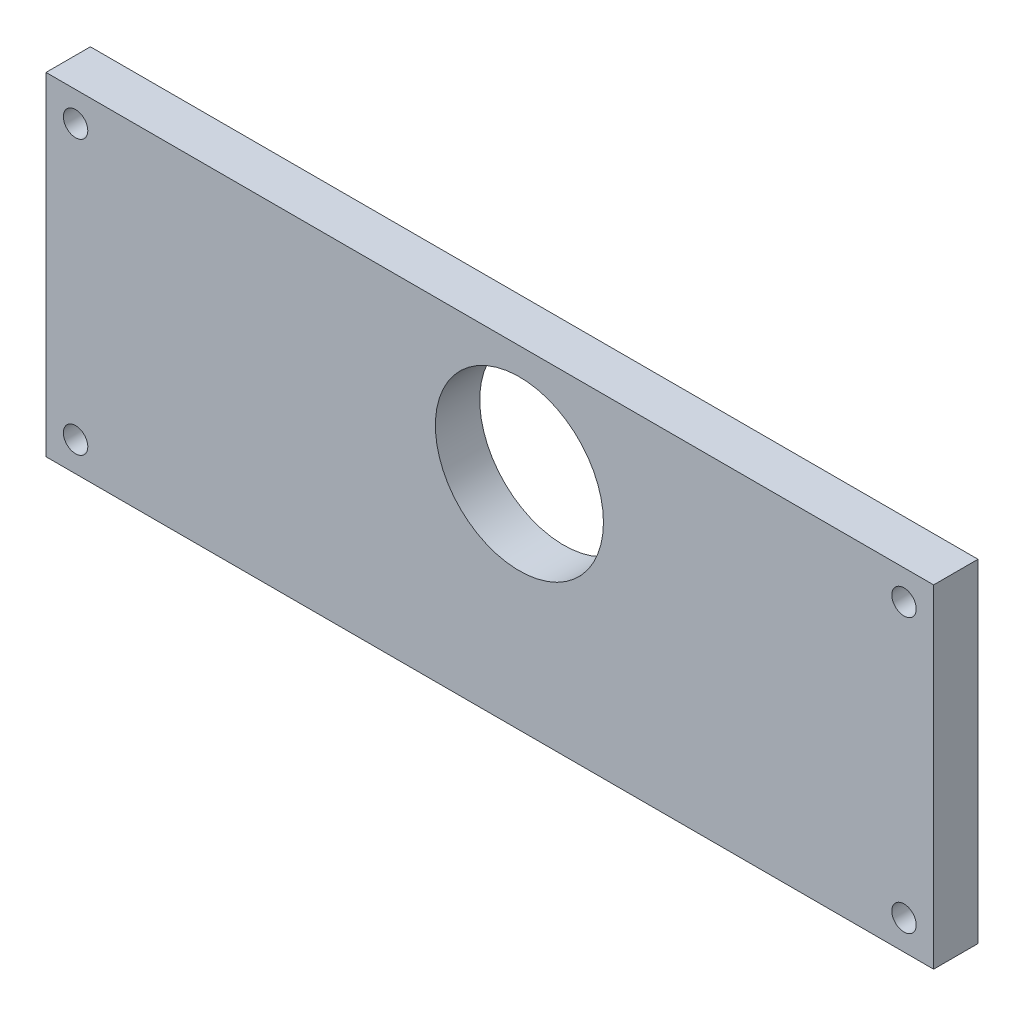
ISO-10303-21;
HEADER;
FILE_DESCRIPTION(('STEP AP214'),'2;1');
FILE_NAME('part.step','',(''),(''),'','','');
FILE_SCHEMA(('AUTOMOTIVE_DESIGN { 1 0 10303 214 1 1 1 1 }'));
ENDSEC;
DATA;
#1=APPLICATION_CONTEXT('core data for automotive mechanical design processes');
#2=APPLICATION_PROTOCOL_DEFINITION('international standard','automotive_design',2000,#1);
#3=PRODUCT_CONTEXT('',#1,'mechanical');
#4=PRODUCT('Part','Part','',(#3));
#5=PRODUCT_RELATED_PRODUCT_CATEGORY('part','',(#4));
#6=PRODUCT_DEFINITION_FORMATION('','',#4);
#7=PRODUCT_DEFINITION_CONTEXT('part definition',#1,'design');
#8=PRODUCT_DEFINITION('design','',#6,#7);
#9=PRODUCT_DEFINITION_SHAPE('','',#8);
#10=(LENGTH_UNIT() NAMED_UNIT(*) SI_UNIT(.MILLI.,.METRE.));
#11=(NAMED_UNIT(*) PLANE_ANGLE_UNIT() SI_UNIT($,.RADIAN.));
#12=(NAMED_UNIT(*) SI_UNIT($,.STERADIAN.) SOLID_ANGLE_UNIT());
#13=UNCERTAINTY_MEASURE_WITH_UNIT(LENGTH_MEASURE(1.E-05),#10,'distance_accuracy_value','');
#14=(GEOMETRIC_REPRESENTATION_CONTEXT(3) GLOBAL_UNCERTAINTY_ASSIGNED_CONTEXT((#13)) GLOBAL_UNIT_ASSIGNED_CONTEXT((#10,
#11,#12)) REPRESENTATION_CONTEXT('',''));
#15=CARTESIAN_POINT('',(0.,0.,0.));
#16=DIRECTION('',(0.,0.,1.));
#17=DIRECTION('',(1.,0.,0.));
#18=AXIS2_PLACEMENT_3D('',#15,#16,#17);
#19=CARTESIAN_POINT('',(4.,41.,6.));
#20=DIRECTION('',(0.,0.,-1.));
#21=DIRECTION('',(-1.,0.,0.));
#22=AXIS2_PLACEMENT_3D('',#19,#20,#21);
#23=CYLINDRICAL_SURFACE('',#22,1.65);
#24=CARTESIAN_POINT('',(4.,41.,6.));
#25=DIRECTION('',(0.,0.,1.));
#26=DIRECTION('',(1.,0.,0.));
#27=AXIS2_PLACEMENT_3D('',#24,#25,#26);
#28=CIRCLE('',#27,1.65);
#29=CARTESIAN_POINT('',(5.65,41.,6.));
#30=VERTEX_POINT('',#29);
#31=EDGE_CURVE('E139',#30,#30,#28,.T.);
#32=ORIENTED_EDGE('',*,*,#31,.T.);
#33=EDGE_LOOP('',(#32));
#34=FACE_BOUND('',#33,.T.);
#35=CARTESIAN_POINT('',(4.,41.,3.));
#36=DIRECTION('',(0.,0.,-1.));
#37=DIRECTION('',(-1.,0.,0.));
#38=AXIS2_PLACEMENT_3D('',#35,#36,#37);
#39=CIRCLE('',#38,1.65);
#40=CARTESIAN_POINT('',(2.35,41.,3.));
#41=VERTEX_POINT('',#40);
#42=EDGE_CURVE('E163',#41,#41,#39,.T.);
#43=ORIENTED_EDGE('',*,*,#42,.T.);
#44=EDGE_LOOP('',(#43));
#45=FACE_BOUND('',#44,.T.);
#46=ADVANCED_FACE('F43',(#34,#45),#23,.F.);
#47=CARTESIAN_POINT('',(4.,4.,6.));
#48=DIRECTION('',(0.,0.,-1.));
#49=DIRECTION('',(-1.,0.,0.));
#50=AXIS2_PLACEMENT_3D('',#47,#48,#49);
#51=CYLINDRICAL_SURFACE('',#50,1.65);
#52=CARTESIAN_POINT('',(4.,4.,6.));
#53=DIRECTION('',(0.,0.,1.));
#54=DIRECTION('',(-1.,0.,0.));
#55=AXIS2_PLACEMENT_3D('',#52,#53,#54);
#56=CIRCLE('',#55,1.65);
#57=CARTESIAN_POINT('',(2.35,4.,6.));
#58=VERTEX_POINT('',#57);
#59=EDGE_CURVE('E146',#58,#58,#56,.T.);
#60=ORIENTED_EDGE('',*,*,#59,.T.);
#61=EDGE_LOOP('',(#60));
#62=FACE_BOUND('',#61,.T.);
#63=CARTESIAN_POINT('',(4.,4.,3.));
#64=DIRECTION('',(0.,0.,-1.));
#65=DIRECTION('',(-1.,0.,0.));
#66=AXIS2_PLACEMENT_3D('',#63,#64,#65);
#67=CIRCLE('',#66,1.65);
#68=CARTESIAN_POINT('',(2.35,4.,3.));
#69=VERTEX_POINT('',#68);
#70=EDGE_CURVE('E170',#69,#69,#67,.T.);
#71=ORIENTED_EDGE('',*,*,#70,.T.);
#72=EDGE_LOOP('',(#71));
#73=FACE_BOUND('',#72,.T.);
#74=ADVANCED_FACE('F232',(#62,#73),#51,.F.);
#75=CARTESIAN_POINT('',(116.,41.,6.));
#76=DIRECTION('',(0.,0.,-1.));
#77=DIRECTION('',(-1.,0.,0.));
#78=AXIS2_PLACEMENT_3D('',#75,#76,#77);
#79=CYLINDRICAL_SURFACE('',#78,1.65);
#80=CARTESIAN_POINT('',(116.,41.,6.));
#81=DIRECTION('',(0.,0.,1.));
#82=DIRECTION('',(-1.,0.,0.));
#83=AXIS2_PLACEMENT_3D('',#80,#81,#82);
#84=CIRCLE('',#83,1.65);
#85=CARTESIAN_POINT('',(114.35,41.,6.));
#86=VERTEX_POINT('',#85);
#87=EDGE_CURVE('E150',#86,#86,#84,.T.);
#88=ORIENTED_EDGE('',*,*,#87,.T.);
#89=EDGE_LOOP('',(#88));
#90=FACE_BOUND('',#89,.T.);
#91=CARTESIAN_POINT('',(116.,41.,3.));
#92=DIRECTION('',(0.,0.,-1.));
#93=DIRECTION('',(-1.,0.,0.));
#94=AXIS2_PLACEMENT_3D('',#91,#92,#93);
#95=CIRCLE('',#94,1.65);
#96=CARTESIAN_POINT('',(114.35,41.,3.));
#97=VERTEX_POINT('',#96);
#98=EDGE_CURVE('E171',#97,#97,#95,.T.);
#99=ORIENTED_EDGE('',*,*,#98,.T.);
#100=EDGE_LOOP('',(#99));
#101=FACE_BOUND('',#100,.T.);
#102=ADVANCED_FACE('F238',(#90,#101),#79,.F.);
#103=CARTESIAN_POINT('',(116.,4.,6.));
#104=DIRECTION('',(0.,0.,-1.));
#105=DIRECTION('',(-1.,0.,0.));
#106=AXIS2_PLACEMENT_3D('',#103,#104,#105);
#107=CYLINDRICAL_SURFACE('',#106,1.65);
#108=CARTESIAN_POINT('',(116.,4.,6.));
#109=DIRECTION('',(0.,0.,1.));
#110=DIRECTION('',(1.,0.,0.));
#111=AXIS2_PLACEMENT_3D('',#108,#109,#110);
#112=CIRCLE('',#111,1.65);
#113=CARTESIAN_POINT('',(117.65,4.,6.));
#114=VERTEX_POINT('',#113);
#115=EDGE_CURVE('E154',#114,#114,#112,.T.);
#116=ORIENTED_EDGE('',*,*,#115,.T.);
#117=EDGE_LOOP('',(#116));
#118=FACE_BOUND('',#117,.T.);
#119=CARTESIAN_POINT('',(116.,4.,3.));
#120=DIRECTION('',(0.,0.,-1.));
#121=DIRECTION('',(-1.,0.,0.));
#122=AXIS2_PLACEMENT_3D('',#119,#120,#121);
#123=CIRCLE('',#122,1.65);
#124=CARTESIAN_POINT('',(114.35,4.,3.));
#125=VERTEX_POINT('',#124);
#126=EDGE_CURVE('E184',#125,#125,#123,.T.);
#127=ORIENTED_EDGE('',*,*,#126,.T.);
#128=EDGE_LOOP('',(#127));
#129=FACE_BOUND('',#128,.T.);
#130=ADVANCED_FACE('F250',(#118,#129),#107,.F.);
#131=CARTESIAN_POINT('',(0.,0.,6.));
#132=DIRECTION('',(0.,0.,-1.));
#133=DIRECTION('',(-1.,0.,0.));
#134=AXIS2_PLACEMENT_3D('',#131,#132,#133);
#135=PLANE('',#134);
#136=DIRECTION('',(0.,-1.,0.));
#137=VECTOR('',#136,1.);
#138=CARTESIAN_POINT('',(0.,0.,6.));
#139=LINE('',#138,#137);
#140=CARTESIAN_POINT('',(0.,45.,6.));
#141=VERTEX_POINT('',#140);
#142=CARTESIAN_POINT('',(0.,0.,6.));
#143=VERTEX_POINT('',#142);
#144=EDGE_CURVE('E97',#141,#143,#139,.T.);
#145=ORIENTED_EDGE('',*,*,#144,.T.);
#146=DIRECTION('',(1.,0.,0.));
#147=VECTOR('',#146,1.);
#148=CARTESIAN_POINT('',(0.,0.,6.));
#149=LINE('',#148,#147);
#150=CARTESIAN_POINT('',(120.,0.,6.));
#151=VERTEX_POINT('',#150);
#152=EDGE_CURVE('E91',#143,#151,#149,.T.);
#153=ORIENTED_EDGE('',*,*,#152,.T.);
#154=DIRECTION('',(0.,1.,0.));
#155=VECTOR('',#154,1.);
#156=CARTESIAN_POINT('',(120.,0.,6.));
#157=LINE('',#156,#155);
#158=CARTESIAN_POINT('',(120.,45.,6.));
#159=VERTEX_POINT('',#158);
#160=EDGE_CURVE('E95',#151,#159,#157,.T.);
#161=ORIENTED_EDGE('',*,*,#160,.T.);
#162=DIRECTION('',(-1.,0.,0.));
#163=VECTOR('',#162,1.);
#164=CARTESIAN_POINT('',(0.,45.,6.));
#165=LINE('',#164,#163);
#166=EDGE_CURVE('E61',#159,#141,#165,.T.);
#167=ORIENTED_EDGE('',*,*,#166,.T.);
#168=EDGE_LOOP('',(#145,#153,#161,#167));
#169=FACE_BOUND('',#168,.T.);
#170=CARTESIAN_POINT('',(64.,30.,6.));
#171=DIRECTION('',(0.,0.,1.));
#172=DIRECTION('',(1.,0.,0.));
#173=AXIS2_PLACEMENT_3D('',#170,#171,#172);
#174=CIRCLE('',#173,11.3625);
#175=CARTESIAN_POINT('',(75.3625,30.,6.));
#176=VERTEX_POINT('',#175);
#177=EDGE_CURVE('E117',#176,#176,#174,.T.);
#178=ORIENTED_EDGE('',*,*,#177,.F.);
#179=EDGE_LOOP('',(#178));
#180=FACE_BOUND('',#179,.T.);
#181=ORIENTED_EDGE('',*,*,#31,.F.);
#182=EDGE_LOOP('',(#181));
#183=FACE_BOUND('',#182,.T.);
#184=ORIENTED_EDGE('',*,*,#59,.F.);
#185=EDGE_LOOP('',(#184));
#186=FACE_BOUND('',#185,.T.);
#187=ORIENTED_EDGE('',*,*,#87,.F.);
#188=EDGE_LOOP('',(#187));
#189=FACE_BOUND('',#188,.T.);
#190=ORIENTED_EDGE('',*,*,#115,.F.);
#191=EDGE_LOOP('',(#190));
#192=FACE_BOUND('',#191,.T.);
#193=ADVANCED_FACE('F92',(#169,#180,#183,#186,#189,#192),#135,.F.);
#194=CARTESIAN_POINT('',(0.,0.,0.));
#195=DIRECTION('',(0.,0.,-1.));
#196=DIRECTION('',(-1.,0.,0.));
#197=AXIS2_PLACEMENT_3D('',#194,#195,#196);
#198=PLANE('',#197);
#199=CARTESIAN_POINT('',(116.,41.,0.));
#200=DIRECTION('',(0.,0.,-1.));
#201=DIRECTION('',(-1.,0.,0.));
#202=AXIS2_PLACEMENT_3D('',#199,#200,#201);
#203=CIRCLE('',#202,3.00000000000001);
#204=CARTESIAN_POINT('',(113.,41.,0.));
#205=VERTEX_POINT('',#204);
#206=EDGE_CURVE('E176',#205,#205,#203,.T.);
#207=ORIENTED_EDGE('',*,*,#206,.F.);
#208=EDGE_LOOP('',(#207));
#209=FACE_BOUND('',#208,.T.);
#210=CARTESIAN_POINT('',(116.,4.,0.));
#211=DIRECTION('',(0.,0.,-1.));
#212=DIRECTION('',(-1.,0.,0.));
#213=AXIS2_PLACEMENT_3D('',#210,#211,#212);
#214=CIRCLE('',#213,3.00000000000001);
#215=CARTESIAN_POINT('',(113.,4.,0.));
#216=VERTEX_POINT('',#215);
#217=EDGE_CURVE('E189',#216,#216,#214,.T.);
#218=ORIENTED_EDGE('',*,*,#217,.F.);
#219=EDGE_LOOP('',(#218));
#220=FACE_BOUND('',#219,.T.);
#221=CARTESIAN_POINT('',(4.,4.,0.));
#222=DIRECTION('',(0.,0.,-1.));
#223=DIRECTION('',(-1.,0.,0.));
#224=AXIS2_PLACEMENT_3D('',#221,#222,#223);
#225=CIRCLE('',#224,3.);
#226=CARTESIAN_POINT('',(0.999999999999999,4.,0.));
#227=VERTEX_POINT('',#226);
#228=EDGE_CURVE('E199',#227,#227,#225,.T.);
#229=ORIENTED_EDGE('',*,*,#228,.F.);
#230=EDGE_LOOP('',(#229));
#231=FACE_BOUND('',#230,.T.);
#232=CARTESIAN_POINT('',(4.,41.,0.));
#233=DIRECTION('',(0.,0.,-1.));
#234=DIRECTION('',(-1.,0.,0.));
#235=AXIS2_PLACEMENT_3D('',#232,#233,#234);
#236=CIRCLE('',#235,3.);
#237=CARTESIAN_POINT('',(0.999999999999997,41.,0.));
#238=VERTEX_POINT('',#237);
#239=EDGE_CURVE('E159',#238,#238,#236,.T.);
#240=ORIENTED_EDGE('',*,*,#239,.F.);
#241=EDGE_LOOP('',(#240));
#242=FACE_BOUND('',#241,.T.);
#243=DIRECTION('',(0.,-1.,0.));
#244=VECTOR('',#243,1.);
#245=CARTESIAN_POINT('',(0.,0.,0.));
#246=LINE('',#245,#244);
#247=CARTESIAN_POINT('',(0.,45.,0.));
#248=VERTEX_POINT('',#247);
#249=CARTESIAN_POINT('',(0.,0.,0.));
#250=VERTEX_POINT('',#249);
#251=EDGE_CURVE('E113',#248,#250,#246,.T.);
#252=ORIENTED_EDGE('',*,*,#251,.F.);
#253=DIRECTION('',(-1.,0.,0.));
#254=VECTOR('',#253,1.);
#255=CARTESIAN_POINT('',(0.,45.,0.));
#256=LINE('',#255,#254);
#257=CARTESIAN_POINT('',(120.,45.,0.));
#258=VERTEX_POINT('',#257);
#259=EDGE_CURVE('E84',#258,#248,#256,.T.);
#260=ORIENTED_EDGE('',*,*,#259,.F.);
#261=DIRECTION('',(0.,1.,0.));
#262=VECTOR('',#261,1.);
#263=CARTESIAN_POINT('',(120.,0.,0.));
#264=LINE('',#263,#262);
#265=CARTESIAN_POINT('',(120.,0.,0.));
#266=VERTEX_POINT('',#265);
#267=EDGE_CURVE('E78',#266,#258,#264,.T.);
#268=ORIENTED_EDGE('',*,*,#267,.F.);
#269=DIRECTION('',(1.,0.,0.));
#270=VECTOR('',#269,1.);
#271=CARTESIAN_POINT('',(0.,0.,0.));
#272=LINE('',#271,#270);
#273=EDGE_CURVE('E102',#250,#266,#272,.T.);
#274=ORIENTED_EDGE('',*,*,#273,.F.);
#275=EDGE_LOOP('',(#252,#260,#268,#274));
#276=FACE_BOUND('',#275,.T.);
#277=CARTESIAN_POINT('',(64.,30.,0.));
#278=DIRECTION('',(0.,0.,1.));
#279=DIRECTION('',(1.,0.,0.));
#280=AXIS2_PLACEMENT_3D('',#277,#278,#279);
#281=CIRCLE('',#280,11.3625);
#282=CARTESIAN_POINT('',(75.3625,30.,0.));
#283=VERTEX_POINT('',#282);
#284=EDGE_CURVE('E135',#283,#283,#281,.T.);
#285=ORIENTED_EDGE('',*,*,#284,.T.);
#286=EDGE_LOOP('',(#285));
#287=FACE_BOUND('',#286,.T.);
#288=ADVANCED_FACE('F130',(#209,#220,#231,#242,#276,#287),#198,.T.);
#289=CARTESIAN_POINT('',(0.,0.,6.));
#290=DIRECTION('',(1.,0.,0.));
#291=DIRECTION('',(0.,0.,-1.));
#292=AXIS2_PLACEMENT_3D('',#289,#290,#291);
#293=PLANE('',#292);
#294=ORIENTED_EDGE('',*,*,#251,.T.);
#295=DIRECTION('',(0.,0.,-1.));
#296=VECTOR('',#295,1.);
#297=CARTESIAN_POINT('',(0.,0.,6.));
#298=LINE('',#297,#296);
#299=EDGE_CURVE('E11',#143,#250,#298,.T.);
#300=ORIENTED_EDGE('',*,*,#299,.F.);
#301=ORIENTED_EDGE('',*,*,#144,.F.);
#302=DIRECTION('',(0.,0.,-1.));
#303=VECTOR('',#302,1.);
#304=CARTESIAN_POINT('',(0.,45.,6.));
#305=LINE('',#304,#303);
#306=EDGE_CURVE('E109',#141,#248,#305,.T.);
#307=ORIENTED_EDGE('',*,*,#306,.T.);
#308=EDGE_LOOP('',(#294,#300,#301,#307));
#309=FACE_BOUND('',#308,.T.);
#310=ADVANCED_FACE('F45',(#309),#293,.F.);
#311=CARTESIAN_POINT('',(0.,0.,6.));
#312=DIRECTION('',(0.,1.,0.));
#313=DIRECTION('',(0.,0.,1.));
#314=AXIS2_PLACEMENT_3D('',#311,#312,#313);
#315=PLANE('',#314);
#316=ORIENTED_EDGE('',*,*,#273,.T.);
#317=DIRECTION('',(0.,0.,-1.));
#318=VECTOR('',#317,1.);
#319=CARTESIAN_POINT('',(120.,0.,6.));
#320=LINE('',#319,#318);
#321=EDGE_CURVE('E53',#151,#266,#320,.T.);
#322=ORIENTED_EDGE('',*,*,#321,.F.);
#323=ORIENTED_EDGE('',*,*,#152,.F.);
#324=ORIENTED_EDGE('',*,*,#299,.T.);
#325=EDGE_LOOP('',(#316,#322,#323,#324));
#326=FACE_BOUND('',#325,.T.);
#327=ADVANCED_FACE('F101',(#326),#315,.F.);
#328=CARTESIAN_POINT('',(120.,0.,6.));
#329=DIRECTION('',(-1.,0.,0.));
#330=DIRECTION('',(0.,0.,1.));
#331=AXIS2_PLACEMENT_3D('',#328,#329,#330);
#332=PLANE('',#331);
#333=ORIENTED_EDGE('',*,*,#267,.T.);
#334=DIRECTION('',(0.,0.,-1.));
#335=VECTOR('',#334,1.);
#336=CARTESIAN_POINT('',(120.,45.,6.));
#337=LINE('',#336,#335);
#338=EDGE_CURVE('E104',#159,#258,#337,.T.);
#339=ORIENTED_EDGE('',*,*,#338,.F.);
#340=ORIENTED_EDGE('',*,*,#160,.F.);
#341=ORIENTED_EDGE('',*,*,#321,.T.);
#342=EDGE_LOOP('',(#333,#339,#340,#341));
#343=FACE_BOUND('',#342,.T.);
#344=ADVANCED_FACE('F105',(#343),#332,.F.);
#345=CARTESIAN_POINT('',(0.,45.,6.));
#346=DIRECTION('',(0.,-1.,0.));
#347=DIRECTION('',(0.,0.,-1.));
#348=AXIS2_PLACEMENT_3D('',#345,#346,#347);
#349=PLANE('',#348);
#350=ORIENTED_EDGE('',*,*,#259,.T.);
#351=ORIENTED_EDGE('',*,*,#306,.F.);
#352=ORIENTED_EDGE('',*,*,#166,.F.);
#353=ORIENTED_EDGE('',*,*,#338,.T.);
#354=EDGE_LOOP('',(#350,#351,#352,#353));
#355=FACE_BOUND('',#354,.T.);
#356=ADVANCED_FACE('F127',(#355),#349,.F.);
#357=CARTESIAN_POINT('',(64.,30.,6.));
#358=DIRECTION('',(0.,0.,-1.));
#359=DIRECTION('',(-1.,0.,0.));
#360=AXIS2_PLACEMENT_3D('',#357,#358,#359);
#361=CYLINDRICAL_SURFACE('',#360,11.3625);
#362=ORIENTED_EDGE('',*,*,#177,.T.);
#363=EDGE_LOOP('',(#362));
#364=FACE_BOUND('',#363,.T.);
#365=ORIENTED_EDGE('',*,*,#284,.F.);
#366=EDGE_LOOP('',(#365));
#367=FACE_BOUND('',#366,.T.);
#368=ADVANCED_FACE('F244',(#364,#367),#361,.F.);
#369=CARTESIAN_POINT('',(116.,4.,3.));
#370=DIRECTION('',(0.,0.,-1.));
#371=DIRECTION('',(-1.,0.,0.));
#372=AXIS2_PLACEMENT_3D('',#369,#370,#371);
#373=CYLINDRICAL_SURFACE('',#372,3.00000000000001);
#374=CARTESIAN_POINT('',(116.,4.,3.));
#375=DIRECTION('',(0.,0.,-1.));
#376=DIRECTION('',(-1.,0.,0.));
#377=AXIS2_PLACEMENT_3D('',#374,#375,#376);
#378=CIRCLE('',#377,3.00000000000001);
#379=CARTESIAN_POINT('',(113.,4.,3.));
#380=VERTEX_POINT('',#379);
#381=EDGE_CURVE('E175',#380,#380,#378,.T.);
#382=ORIENTED_EDGE('',*,*,#381,.F.);
#383=EDGE_LOOP('',(#382));
#384=FACE_BOUND('',#383,.T.);
#385=ORIENTED_EDGE('',*,*,#217,.T.);
#386=EDGE_LOOP('',(#385));
#387=FACE_BOUND('',#386,.T.);
#388=ADVANCED_FACE('F247',(#384,#387),#373,.F.);
#389=CARTESIAN_POINT('',(116.,4.,3.));
#390=DIRECTION('',(0.,0.,-1.));
#391=DIRECTION('',(-1.,0.,0.));
#392=AXIS2_PLACEMENT_3D('',#389,#390,#391);
#393=PLANE('',#392);
#394=ORIENTED_EDGE('',*,*,#126,.F.);
#395=EDGE_LOOP('',(#394));
#396=FACE_BOUND('',#395,.T.);
#397=ORIENTED_EDGE('',*,*,#381,.T.);
#398=EDGE_LOOP('',(#397));
#399=FACE_BOUND('',#398,.T.);
#400=ADVANCED_FACE('F354',(#396,#399),#393,.T.);
#401=CARTESIAN_POINT('',(116.,41.,3.));
#402=DIRECTION('',(0.,0.,-1.));
#403=DIRECTION('',(-1.,0.,0.));
#404=AXIS2_PLACEMENT_3D('',#401,#402,#403);
#405=CYLINDRICAL_SURFACE('',#404,3.00000000000001);
#406=CARTESIAN_POINT('',(116.,41.,3.));
#407=DIRECTION('',(0.,0.,-1.));
#408=DIRECTION('',(-1.,0.,0.));
#409=AXIS2_PLACEMENT_3D('',#406,#407,#408);
#410=CIRCLE('',#409,3.00000000000001);
#411=CARTESIAN_POINT('',(113.,41.,3.));
#412=VERTEX_POINT('',#411);
#413=EDGE_CURVE('E177',#412,#412,#410,.T.);
#414=ORIENTED_EDGE('',*,*,#413,.F.);
#415=EDGE_LOOP('',(#414));
#416=FACE_BOUND('',#415,.T.);
#417=ORIENTED_EDGE('',*,*,#206,.T.);
#418=EDGE_LOOP('',(#417));
#419=FACE_BOUND('',#418,.T.);
#420=ADVANCED_FACE('F365',(#416,#419),#405,.F.);
#421=CARTESIAN_POINT('',(116.,41.,3.));
#422=DIRECTION('',(0.,0.,-1.));
#423=DIRECTION('',(-1.,0.,0.));
#424=AXIS2_PLACEMENT_3D('',#421,#422,#423);
#425=PLANE('',#424);
#426=ORIENTED_EDGE('',*,*,#98,.F.);
#427=EDGE_LOOP('',(#426));
#428=FACE_BOUND('',#427,.T.);
#429=ORIENTED_EDGE('',*,*,#413,.T.);
#430=EDGE_LOOP('',(#429));
#431=FACE_BOUND('',#430,.T.);
#432=ADVANCED_FACE('F376',(#428,#431),#425,.T.);
#433=CARTESIAN_POINT('',(4.,4.,3.));
#434=DIRECTION('',(0.,0.,-1.));
#435=DIRECTION('',(-1.,0.,0.));
#436=AXIS2_PLACEMENT_3D('',#433,#434,#435);
#437=CYLINDRICAL_SURFACE('',#436,3.);
#438=CARTESIAN_POINT('',(4.,4.,3.));
#439=DIRECTION('',(0.,0.,-1.));
#440=DIRECTION('',(-1.,0.,0.));
#441=AXIS2_PLACEMENT_3D('',#438,#439,#440);
#442=CIRCLE('',#441,3.);
#443=CARTESIAN_POINT('',(0.999999999999999,4.,3.));
#444=VERTEX_POINT('',#443);
#445=EDGE_CURVE('E188',#444,#444,#442,.T.);
#446=ORIENTED_EDGE('',*,*,#445,.F.);
#447=EDGE_LOOP('',(#446));
#448=FACE_BOUND('',#447,.T.);
#449=ORIENTED_EDGE('',*,*,#228,.T.);
#450=EDGE_LOOP('',(#449));
#451=FACE_BOUND('',#450,.T.);
#452=ADVANCED_FACE('F207',(#448,#451),#437,.F.);
#453=CARTESIAN_POINT('',(4.,4.,3.));
#454=DIRECTION('',(0.,0.,-1.));
#455=DIRECTION('',(-1.,0.,0.));
#456=AXIS2_PLACEMENT_3D('',#453,#454,#455);
#457=PLANE('',#456);
#458=ORIENTED_EDGE('',*,*,#70,.F.);
#459=EDGE_LOOP('',(#458));
#460=FACE_BOUND('',#459,.T.);
#461=ORIENTED_EDGE('',*,*,#445,.T.);
#462=EDGE_LOOP('',(#461));
#463=FACE_BOUND('',#462,.T.);
#464=ADVANCED_FACE('F218',(#460,#463),#457,.T.);
#465=CARTESIAN_POINT('',(4.,41.,3.));
#466=DIRECTION('',(0.,0.,-1.));
#467=DIRECTION('',(-1.,0.,0.));
#468=AXIS2_PLACEMENT_3D('',#465,#466,#467);
#469=CYLINDRICAL_SURFACE('',#468,3.);
#470=CARTESIAN_POINT('',(4.,41.,3.));
#471=DIRECTION('',(0.,0.,-1.));
#472=DIRECTION('',(-1.,0.,0.));
#473=AXIS2_PLACEMENT_3D('',#470,#471,#472);
#474=CIRCLE('',#473,3.);
#475=CARTESIAN_POINT('',(0.999999999999997,41.,3.));
#476=VERTEX_POINT('',#475);
#477=EDGE_CURVE('E158',#476,#476,#474,.T.);
#478=ORIENTED_EDGE('',*,*,#477,.F.);
#479=EDGE_LOOP('',(#478));
#480=FACE_BOUND('',#479,.T.);
#481=ORIENTED_EDGE('',*,*,#239,.T.);
#482=EDGE_LOOP('',(#481));
#483=FACE_BOUND('',#482,.T.);
#484=ADVANCED_FACE('F215',(#480,#483),#469,.F.);
#485=CARTESIAN_POINT('',(4.,41.,3.));
#486=DIRECTION('',(0.,0.,-1.));
#487=DIRECTION('',(-1.,0.,0.));
#488=AXIS2_PLACEMENT_3D('',#485,#486,#487);
#489=PLANE('',#488);
#490=ORIENTED_EDGE('',*,*,#42,.F.);
#491=EDGE_LOOP('',(#490));
#492=FACE_BOUND('',#491,.T.);
#493=ORIENTED_EDGE('',*,*,#477,.T.);
#494=EDGE_LOOP('',(#493));
#495=FACE_BOUND('',#494,.T.);
#496=ADVANCED_FACE('F217',(#492,#495),#489,.T.);
#497=CLOSED_SHELL('',(#46,#74,#102,#130,#193,#288,#310,#327,#344,#356,#368,#388,#400,#420,#432,
#452,#464,#484,#496));
#498=MANIFOLD_SOLID_BREP('B2',#497);
#499=ADVANCED_BREP_SHAPE_REPRESENTATION('',(#18,#498),#14);
#500=SHAPE_DEFINITION_REPRESENTATION(#9,#499);
ENDSEC;
END-ISO-10303-21;
